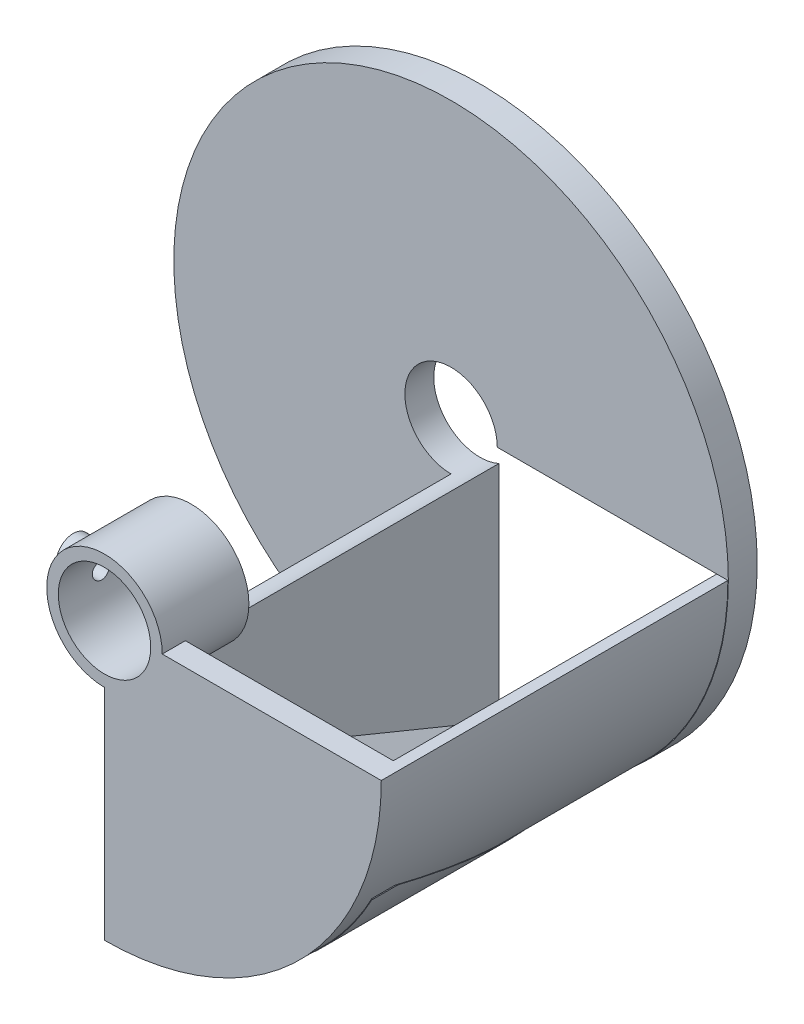
ISO-10303-21;
HEADER;
FILE_DESCRIPTION(('STEP AP214'),'2;1');
FILE_NAME('part.step','',(''),(''),'','','');
FILE_SCHEMA(('AUTOMOTIVE_DESIGN { 1 0 10303 214 1 1 1 1 }'));
ENDSEC;
DATA;
#1=APPLICATION_CONTEXT('core data for automotive mechanical design processes');
#2=APPLICATION_PROTOCOL_DEFINITION('international standard','automotive_design',2000,#1);
#3=PRODUCT_CONTEXT('',#1,'mechanical');
#4=PRODUCT('Part','Part','',(#3));
#5=PRODUCT_RELATED_PRODUCT_CATEGORY('part','',(#4));
#6=PRODUCT_DEFINITION_FORMATION('','',#4);
#7=PRODUCT_DEFINITION_CONTEXT('part definition',#1,'design');
#8=PRODUCT_DEFINITION('design','',#6,#7);
#9=PRODUCT_DEFINITION_SHAPE('','',#8);
#10=(LENGTH_UNIT() NAMED_UNIT(*) SI_UNIT(.MILLI.,.METRE.));
#11=(NAMED_UNIT(*) PLANE_ANGLE_UNIT() SI_UNIT($,.RADIAN.));
#12=(NAMED_UNIT(*) SI_UNIT($,.STERADIAN.) SOLID_ANGLE_UNIT());
#13=UNCERTAINTY_MEASURE_WITH_UNIT(LENGTH_MEASURE(1.E-05),#10,'distance_accuracy_value','');
#14=(GEOMETRIC_REPRESENTATION_CONTEXT(3) GLOBAL_UNCERTAINTY_ASSIGNED_CONTEXT((#13)) GLOBAL_UNIT_ASSIGNED_CONTEXT((#10,
#11,#12)) REPRESENTATION_CONTEXT('',''));
#15=CARTESIAN_POINT('',(0.,0.,0.));
#16=DIRECTION('',(0.,0.,1.));
#17=DIRECTION('',(1.,0.,0.));
#18=AXIS2_PLACEMENT_3D('',#15,#16,#17);
#19=CARTESIAN_POINT('',(42.2763891638967,-45.883169834338,61.));
#20=DIRECTION('',(0.,0.,-1.));
#21=DIRECTION('',(-1.,0.,0.));
#22=AXIS2_PLACEMENT_3D('',#19,#20,#21);
#23=PLANE('',#22);
#24=CARTESIAN_POINT('',(0.,0.,61.));
#25=DIRECTION('',(0.,0.,-1.));
#26=DIRECTION('',(-1.,0.,0.));
#27=AXIS2_PLACEMENT_3D('',#24,#25,#26);
#28=CIRCLE('',#27,48.);
#29=CARTESIAN_POINT('',(42.2763891638967,-22.731188250128,61.));
#30=VERTEX_POINT('',#29);
#31=CARTESIAN_POINT('',(14.0973304548521,-45.883169834338,61.));
#32=VERTEX_POINT('',#31);
#33=EDGE_CURVE('E120',#30,#32,#28,.T.);
#34=ORIENTED_EDGE('',*,*,#33,.F.);
#35=DIRECTION('',(0.,-1.,0.));
#36=VECTOR('',#35,1.);
#37=CARTESIAN_POINT('',(42.2763891638967,-45.883169834338,61.));
#38=LINE('',#37,#36);
#39=CARTESIAN_POINT('',(42.2763891638967,-20.883169834338,61.));
#40=VERTEX_POINT('',#39);
#41=EDGE_CURVE('E111',#40,#30,#38,.T.);
#42=ORIENTED_EDGE('',*,*,#41,.F.);
#43=DIRECTION('',(-1.,0.,0.));
#44=VECTOR('',#43,1.);
#45=CARTESIAN_POINT('',(42.2763891638967,-20.883169834338,61.));
#46=LINE('',#45,#44);
#47=CARTESIAN_POINT('',(3.27638916389669,-20.883169834338,61.));
#48=VERTEX_POINT('',#47);
#49=EDGE_CURVE('E99',#40,#48,#46,.T.);
#50=ORIENTED_EDGE('',*,*,#49,.T.);
#51=DIRECTION('',(0.,-1.,0.));
#52=VECTOR('',#51,1.);
#53=CARTESIAN_POINT('',(3.27638916389669,-45.883169834338,61.));
#54=LINE('',#53,#52);
#55=CARTESIAN_POINT('',(3.27638916389669,-45.883169834338,61.));
#56=VERTEX_POINT('',#55);
#57=EDGE_CURVE('E108',#48,#56,#54,.T.);
#58=ORIENTED_EDGE('',*,*,#57,.T.);
#59=DIRECTION('',(-1.,0.,0.));
#60=VECTOR('',#59,1.);
#61=CARTESIAN_POINT('',(42.2763891638967,-45.883169834338,61.));
#62=LINE('',#61,#60);
#63=EDGE_CURVE('E62',#32,#56,#62,.T.);
#64=ORIENTED_EDGE('',*,*,#63,.F.);
#65=EDGE_LOOP('',(#34,#42,#50,#58,#64));
#66=FACE_BOUND('',#65,.T.);
#67=ADVANCED_FACE('F55',(#66),#23,.F.);
#68=CARTESIAN_POINT('',(42.2763891638967,-45.883169834338,61.));
#69=DIRECTION('',(0.,1.,0.));
#70=DIRECTION('',(0.,0.,1.));
#71=AXIS2_PLACEMENT_3D('',#68,#69,#70);
#72=PLANE('',#71);
#73=DIRECTION('',(0.,0.,-1.));
#74=VECTOR('',#73,1.);
#75=CARTESIAN_POINT('',(14.0973304548521,-45.883169834338,100.));
#76=LINE('',#75,#74);
#77=CARTESIAN_POINT('',(14.0973304548521,-45.883169834338,0.));
#78=VERTEX_POINT('',#77);
#79=EDGE_CURVE('E122',#32,#78,#76,.T.);
#80=ORIENTED_EDGE('',*,*,#79,.F.);
#81=ORIENTED_EDGE('',*,*,#63,.T.);
#82=DIRECTION('',(0.,0.,-1.));
#83=VECTOR('',#82,1.);
#84=CARTESIAN_POINT('',(3.27638916389669,-45.883169834338,61.));
#85=LINE('',#84,#83);
#86=CARTESIAN_POINT('',(3.27638916389669,-45.883169834338,0.));
#87=VERTEX_POINT('',#86);
#88=EDGE_CURVE('E102',#56,#87,#85,.T.);
#89=ORIENTED_EDGE('',*,*,#88,.T.);
#90=DIRECTION('',(-1.,0.,0.));
#91=VECTOR('',#90,1.);
#92=CARTESIAN_POINT('',(42.2763891638967,-45.883169834338,0.));
#93=LINE('',#92,#91);
#94=EDGE_CURVE('E90',#78,#87,#93,.T.);
#95=ORIENTED_EDGE('',*,*,#94,.F.);
#96=EDGE_LOOP('',(#80,#81,#89,#95));
#97=FACE_BOUND('',#96,.T.);
#98=ADVANCED_FACE('F103',(#97),#72,.F.);
#99=CARTESIAN_POINT('',(42.2763891638967,-20.883169834338,61.));
#100=DIRECTION('',(0.,-0.925305138660672,0.379223417483882));
#101=DIRECTION('',(0.,-0.379223417483882,-0.925305138660672));
#102=AXIS2_PLACEMENT_3D('',#99,#100,#101);
#103=PLANE('',#102);
#104=CARTESIAN_POINT('',(0.,0.,111.954934395785));
#105=DIRECTION('',(0.,-0.925305138660672,0.379223417483882));
#106=DIRECTION('',(0.,-0.379223417483882,-0.925305138660672));
#107=AXIS2_PLACEMENT_3D('',#104,#105,#106);
#108=ELLIPSE('',#107,126.574461879164,48.);
#109=CARTESIAN_POINT('',(42.2763891638967,-22.731188250128,56.4908350654723));
#110=VERTEX_POINT('',#109);
#111=EDGE_CURVE('E68',#78,#110,#108,.T.);
#112=ORIENTED_EDGE('',*,*,#111,.F.);
#113=ORIENTED_EDGE('',*,*,#94,.T.);
#114=DIRECTION('',(0.,0.379223417483882,0.925305138660672));
#115=VECTOR('',#114,1.);
#116=CARTESIAN_POINT('',(3.27638916389669,-20.883169834338,61.));
#117=LINE('',#116,#115);
#118=EDGE_CURVE('E94',#87,#48,#117,.T.);
#119=ORIENTED_EDGE('',*,*,#118,.T.);
#120=ORIENTED_EDGE('',*,*,#49,.F.);
#121=DIRECTION('',(0.,0.379223417483882,0.925305138660672));
#122=VECTOR('',#121,1.);
#123=CARTESIAN_POINT('',(42.2763891638967,-20.883169834338,61.));
#124=LINE('',#123,#122);
#125=EDGE_CURVE('E76',#110,#40,#124,.T.);
#126=ORIENTED_EDGE('',*,*,#125,.F.);
#127=EDGE_LOOP('',(#112,#113,#119,#120,#126));
#128=FACE_BOUND('',#127,.T.);
#129=ADVANCED_FACE('F92',(#128),#103,.F.);
#130=CARTESIAN_POINT('',(42.2763891638967,0.,0.));
#131=DIRECTION('',(-1.,0.,0.));
#132=DIRECTION('',(0.,0.,1.));
#133=AXIS2_PLACEMENT_3D('',#130,#131,#132);
#134=PLANE('',#133);
#135=DIRECTION('',(0.,0.,-1.));
#136=VECTOR('',#135,1.);
#137=CARTESIAN_POINT('',(42.2763891638967,-22.731188250128,100.));
#138=LINE('',#137,#136);
#139=EDGE_CURVE('E12',#110,#30,#138,.F.);
#140=ORIENTED_EDGE('',*,*,#139,.F.);
#141=ORIENTED_EDGE('',*,*,#125,.T.);
#142=ORIENTED_EDGE('',*,*,#41,.T.);
#143=EDGE_LOOP('',(#140,#141,#142));
#144=FACE_BOUND('',#143,.T.);
#145=ADVANCED_FACE('F129',(#144),#134,.F.);
#146=CARTESIAN_POINT('',(3.27638916389669,0.,0.));
#147=DIRECTION('',(-1.,0.,0.));
#148=DIRECTION('',(0.,0.,1.));
#149=AXIS2_PLACEMENT_3D('',#146,#147,#148);
#150=PLANE('',#149);
#151=ORIENTED_EDGE('',*,*,#57,.F.);
#152=ORIENTED_EDGE('',*,*,#118,.F.);
#153=ORIENTED_EDGE('',*,*,#88,.F.);
#154=EDGE_LOOP('',(#151,#152,#153));
#155=FACE_BOUND('',#154,.T.);
#156=ADVANCED_FACE('F110',(#155),#150,.T.);
#157=CARTESIAN_POINT('',(0.,0.,100.));
#158=DIRECTION('',(0.,0.,-1.));
#159=DIRECTION('',(-1.,0.,0.));
#160=AXIS2_PLACEMENT_3D('',#157,#158,#159);
#161=CYLINDRICAL_SURFACE('',#160,48.);
#162=ORIENTED_EDGE('',*,*,#33,.T.);
#163=ORIENTED_EDGE('',*,*,#79,.T.);
#164=ORIENTED_EDGE('',*,*,#111,.T.);
#165=ORIENTED_EDGE('',*,*,#139,.T.);
#166=EDGE_LOOP('',(#162,#163,#164,#165));
#167=FACE_BOUND('',#166,.T.);
#168=ADVANCED_FACE('F126',(#167),#161,.T.);
#169=CLOSED_SHELL('',(#67,#98,#129,#145,#156,#168));
#170=MANIFOLD_SOLID_BREP('B2',#169);
#171=CARTESIAN_POINT('',(0.,0.,0.));
#172=DIRECTION('',(0.,0.,1.));
#173=DIRECTION('',(1.,0.,0.));
#174=AXIS2_PLACEMENT_3D('',#171,#172,#173);
#175=PLANE('',#174);
#176=CARTESIAN_POINT('',(0.,0.,0.));
#177=DIRECTION('',(0.,0.,1.));
#178=DIRECTION('',(1.,0.,0.));
#179=AXIS2_PLACEMENT_3D('',#176,#177,#178);
#180=CIRCLE('',#179,48.);
#181=CARTESIAN_POINT('',(48.,0.,0.));
#182=VERTEX_POINT('',#181);
#183=EDGE_CURVE('E357',#182,#182,#180,.T.);
#184=ORIENTED_EDGE('',*,*,#183,.F.);
#185=EDGE_LOOP('',(#184));
#186=FACE_BOUND('',#185,.T.);
#187=DIRECTION('',(-1.,0.,0.));
#188=VECTOR('',#187,1.);
#189=CARTESIAN_POINT('',(0.,0.,0.));
#190=LINE('',#189,#188);
#191=CARTESIAN_POINT('',(46.,0.,0.));
#192=VERTEX_POINT('',#191);
#193=CARTESIAN_POINT('',(8.,0.,0.));
#194=VERTEX_POINT('',#193);
#195=EDGE_CURVE('E433',#192,#194,#190,.T.);
#196=ORIENTED_EDGE('',*,*,#195,.T.);
#197=CARTESIAN_POINT('',(0.,0.,0.));
#198=DIRECTION('',(0.,0.,1.));
#199=DIRECTION('',(1.,0.,0.));
#200=AXIS2_PLACEMENT_3D('',#197,#198,#199);
#201=CIRCLE('',#200,8.);
#202=CARTESIAN_POINT('',(3.27638916389669,-7.29830624506127,0.));
#203=VERTEX_POINT('',#202);
#204=EDGE_CURVE('E365',#194,#203,#201,.T.);
#205=ORIENTED_EDGE('',*,*,#204,.T.);
#206=DIRECTION('',(0.,-1.,0.));
#207=VECTOR('',#206,1.);
#208=CARTESIAN_POINT('',(3.27638916389669,0.,0.));
#209=LINE('',#208,#207);
#210=CARTESIAN_POINT('',(3.27638916389669,-45.883169834338,0.));
#211=VERTEX_POINT('',#210);
#212=EDGE_CURVE('E424',#203,#211,#209,.T.);
#213=ORIENTED_EDGE('',*,*,#212,.T.);
#214=CARTESIAN_POINT('',(0.,0.,0.));
#215=DIRECTION('',(0.,0.,-1.));
#216=DIRECTION('',(-1.,0.,0.));
#217=AXIS2_PLACEMENT_3D('',#214,#215,#216);
#218=CIRCLE('',#217,46.);
#219=EDGE_CURVE('E429',#192,#211,#218,.T.);
#220=ORIENTED_EDGE('',*,*,#219,.F.);
#221=EDGE_LOOP('',(#196,#205,#213,#220));
#222=FACE_BOUND('',#221,.T.);
#223=ADVANCED_FACE('F191',(#186,#222),#175,.F.);
#224=CARTESIAN_POINT('',(0.,0.,5.));
#225=DIRECTION('',(0.,0.,-1.));
#226=DIRECTION('',(-1.,0.,0.));
#227=AXIS2_PLACEMENT_3D('',#224,#225,#226);
#228=CYLINDRICAL_SURFACE('',#227,8.);
#229=CARTESIAN_POINT('',(-8.,0.,59.1162877048764));
#230=CARTESIAN_POINT('',(-7.99999848833852,-0.0834717464654708,59.1162845152881));
#231=CARTESIAN_POINT('',(-7.99868009921714,-0.166984992730098,59.109296628257));
#232=CARTESIAN_POINT('',(-7.9935478589052,-0.331658129841798,59.081547709758));
#233=CARTESIAN_POINT('',(-7.98973190166897,-0.412815974152227,59.0607750542366));
#234=CARTESIAN_POINT('',(-7.98003138765458,-0.570372961851803,59.006115003617));
#235=CARTESIAN_POINT('',(-7.97414869946483,-0.646776330685345,58.9722394524238));
#236=CARTESIAN_POINT('',(-7.96095710599783,-0.792807973094008,58.8923688279536));
#237=CARTESIAN_POINT('',(-7.9536483161829,-0.862436794477325,58.8463747357316));
#238=CARTESIAN_POINT('',(-7.93831336430504,-0.993783715930505,58.7429879368727));
#239=CARTESIAN_POINT('',(-7.93028034856351,-1.05540895503183,58.6854782602062));
#240=CARTESIAN_POINT('',(-7.9144531845865,-1.16819606135369,58.5609443957888));
#241=CARTESIAN_POINT('',(-7.90665905354527,-1.21935717689242,58.4939195251071));
#242=CARTESIAN_POINT('',(-7.89212551245005,-1.31014998665793,58.3516016165124));
#243=CARTESIAN_POINT('',(-7.88539493886182,-1.34968721969605,58.2762473345591));
#244=CARTESIAN_POINT('',(-7.87384713211987,-1.41550524332283,58.1198187896996));
#245=CARTESIAN_POINT('',(-7.86902973396962,-1.44178717713098,58.0387450207652));
#246=CARTESIAN_POINT('',(-7.8619226957455,-1.480050535035,57.874172473962));
#247=CARTESIAN_POINT('',(-7.85960445366405,-1.49219390192039,57.7907126076729));
#248=CARTESIAN_POINT('',(-7.85767197152761,-1.50233808095347,57.6229103200681));
#249=CARTESIAN_POINT('',(-7.8580574889876,-1.50034016135374,57.5385679785741));
#250=CARTESIAN_POINT('',(-7.86146292701753,-1.48238979602363,57.3725681796103));
#251=CARTESIAN_POINT('',(-7.86444808147334,-1.46662149996045,57.2908899905762));
#252=CARTESIAN_POINT('',(-7.87266183284666,-1.42186799396207,57.1313592850938));
#253=CARTESIAN_POINT('',(-7.87789052509516,-1.392882222395,57.0535069313671));
#254=CARTESIAN_POINT('',(-7.89003855292588,-1.322336471793,56.9032990258761));
#255=CARTESIAN_POINT('',(-7.89696783823366,-1.28070213532456,56.8309792342956));
#256=CARTESIAN_POINT('',(-7.91172971602918,-1.18609368930417,56.6942829763361));
#257=CARTESIAN_POINT('',(-7.91956240015522,-1.13311842889266,56.6299073171616));
#258=CARTESIAN_POINT('',(-7.93540001272164,-1.01633905685298,56.5098627492039));
#259=CARTESIAN_POINT('',(-7.94340571024031,-0.952377436860684,56.4543470524246));
#260=CARTESIAN_POINT('',(-7.95857386108318,-0.815968037098826,56.354810464201));
#261=CARTESIAN_POINT('',(-7.96573630595245,-0.743520172255768,56.3107896880059));
#262=CARTESIAN_POINT('',(-7.97842539677509,-0.592034988874666,56.2354699510063));
#263=CARTESIAN_POINT('',(-7.98394999136289,-0.512989564446492,56.2041869257585));
#264=CARTESIAN_POINT('',(-7.99272505402719,-0.350639115398696,56.1553856117842));
#265=CARTESIAN_POINT('',(-7.99597576367994,-0.267334544277788,56.137865860831));
#266=CARTESIAN_POINT('',(-7.99980360641981,-0.100148652903388,56.1173016738581));
#267=CARTESIAN_POINT('',(-8.00041950912279,-0.0162940126341374,56.1140473133466));
#268=CARTESIAN_POINT('',(-7.99901543598228,0.150761248092183,56.121543184424));
#269=CARTESIAN_POINT('',(-7.99699558964431,0.233961900480384,56.1322927279416));
#270=CARTESIAN_POINT('',(-7.99057111500406,0.396681573218216,56.1673167400597));
#271=CARTESIAN_POINT('',(-7.98618522374031,0.476224261046063,56.1914849874142));
#272=CARTESIAN_POINT('',(-7.97551842212498,0.630128631824633,56.2525454116551));
#273=CARTESIAN_POINT('',(-7.96923738311334,0.704489962595104,56.2894384524421));
#274=CARTESIAN_POINT('',(-7.95538030357666,0.846816671513216,56.3753658330359));
#275=CARTESIAN_POINT('',(-7.94779086174563,0.914703277015123,56.4245284434132));
#276=CARTESIAN_POINT('',(-7.93219343489711,1.04133832326455,56.5334258422387));
#277=CARTESIAN_POINT('',(-7.92418541084687,1.10008590976087,56.5931616178777));
#278=CARTESIAN_POINT('',(-7.9085247569745,1.20757295872048,56.7224600237878));
#279=CARTESIAN_POINT('',(-7.90087825860257,1.25616916218577,56.7921426130018));
#280=CARTESIAN_POINT('',(-7.88692985578532,1.34096675057787,56.9388053294001));
#281=CARTESIAN_POINT('',(-7.8806279013735,1.37716859613924,57.0157851852468));
#282=CARTESIAN_POINT('',(-7.87013024209574,1.43594673512823,57.1744935721189));
#283=CARTESIAN_POINT('',(-7.86592440436878,1.45858868794786,57.2561970844357));
#284=CARTESIAN_POINT('',(-7.86007203802415,1.48980679326236,57.4223349273978));
#285=CARTESIAN_POINT('',(-7.8584252206579,1.49838453270709,57.5067689488468));
#286=CARTESIAN_POINT('',(-7.85789199803857,1.50117762148355,57.6745360363179));
#287=CARTESIAN_POINT('',(-7.85896215974293,1.49561895003499,57.7578652858334));
#288=CARTESIAN_POINT('',(-7.86364600659998,1.47079175378803,57.9223791269217));
#289=CARTESIAN_POINT('',(-7.86725967655746,1.45152331089332,58.0035637313038));
#290=CARTESIAN_POINT('',(-7.8766050802318,1.39991887583263,58.1613621896718));
#291=CARTESIAN_POINT('',(-7.88233284594965,1.36760735397253,58.2379842962221));
#292=CARTESIAN_POINT('',(-7.8952638755184,1.29085868912205,58.3847559591172));
#293=CARTESIAN_POINT('',(-7.90246724360119,1.24642068948186,58.4549050577211));
#294=CARTESIAN_POINT('',(-7.91767266107745,1.14589487339535,58.5878713849187));
#295=CARTESIAN_POINT('',(-7.92568505353043,1.08964259864304,58.6505631174435));
#296=CARTESIAN_POINT('',(-7.94152833918735,0.967427926742292,58.7656928673409));
#297=CARTESIAN_POINT('',(-7.94935919027328,0.901463301891619,58.8181285258565));
#298=CARTESIAN_POINT('',(-7.96403975968049,0.760984945071878,58.9116986575034));
#299=CARTESIAN_POINT('',(-7.97088000990561,0.68639959064052,58.952727133367));
#300=CARTESIAN_POINT('',(-7.98271619380687,0.531290113653835,59.0216053414815));
#301=CARTESIAN_POINT('',(-7.98771385879037,0.450771651705248,59.0494674519233));
#302=CARTESIAN_POINT('',(-7.99428290707632,0.308347202825153,59.085565019295));
#303=CARTESIAN_POINT('',(-7.99641470878206,0.247273810251871,59.0970663351892));
#304=CARTESIAN_POINT('',(-7.9992737995401,0.124141247115158,59.1124287669928));
#305=CARTESIAN_POINT('',(-8.00000112429805,0.0620821016527095,59.1162900771323));
#306=CARTESIAN_POINT('',(-8.,0.,59.1162877048764));
#307=B_SPLINE_CURVE_WITH_KNOTS('',3,(#229,#230,#231,#232,#233,#234,#235,#236,#237,#238,#239,
#240,#241,#242,#243,#244,#245,#246,#247,#248,#249,#250,#251,#252,#253,#254,#255,#256,#257,#258,
#259,#260,#261,#262,#263,#264,#265,#266,#267,#268,#269,#270,#271,#272,#273,#274,#275,#276,#277,
#278,#279,#280,#281,#282,#283,#284,#285,#286,#287,#288,#289,#290,#291,#292,#293,#294,#295,#296,
#297,#298,#299,#300,#301,#302,#303,#304,#305,#306),.UNSPECIFIED.,.T.,.F.,(4,2,2,2,2,2,2,2,2,2,2,
2,2,2,2,2,2,2,2,2,2,2,2,2,2,2,2,2,2,2,2,2,2,2,2,2,2,2,4),(0.,0.250188200964924,
0.500587642535451,0.750761271230911,1.00091465336891,1.25375118013631,1.50660586283617,
1.76146190504357,2.01629596311948,2.26818151445336,2.52004447587256,2.76859000612767,
3.01714609846788,3.26719262629531,3.5172645404986,3.77127768464078,4.02529337544949,
4.279625883217,4.53393136673746,4.78448174076098,5.03501980464585,5.2836023390783,
5.53220175338033,5.7835177801771,6.034857284131,6.28953436987301,6.54420198954946,
6.79762627818559,7.05102196946514,7.3003925223175,7.54976158541508,7.79866496207694,
8.04758592655425,8.30023369966383,8.55293951262257,8.80792048916317,9.06266126931176,
9.24874344524412,9.43482089039543),.UNSPECIFIED.);
#308=CARTESIAN_POINT('',(-8.,0.,59.1162877048764));
#309=VERTEX_POINT('',#308);
#310=EDGE_CURVE('E313',#309,#309,#307,.T.);
#311=ORIENTED_EDGE('',*,*,#310,.F.);
#312=EDGE_LOOP('',(#311));
#313=FACE_BOUND('',#312,.T.);
#314=CARTESIAN_POINT('',(0.,0.,50.));
#315=DIRECTION('',(0.,0.,1.));
#316=DIRECTION('',(1.,0.,0.));
#317=AXIS2_PLACEMENT_3D('',#314,#315,#316);
#318=CIRCLE('',#317,8.);
#319=CARTESIAN_POINT('',(3.27638916389669,-7.29830624506127,50.));
#320=VERTEX_POINT('',#319);
#321=CARTESIAN_POINT('',(0.,-8.,50.));
#322=VERTEX_POINT('',#321);
#323=EDGE_CURVE('E322',#320,#322,#318,.T.);
#324=ORIENTED_EDGE('',*,*,#323,.F.);
#325=DIRECTION('',(0.,0.,-1.));
#326=VECTOR('',#325,1.);
#327=CARTESIAN_POINT('',(3.27638916389669,-7.29830624506127,61.));
#328=LINE('',#327,#326);
#329=EDGE_CURVE('E419',#320,#203,#328,.T.);
#330=ORIENTED_EDGE('',*,*,#329,.T.);
#331=ORIENTED_EDGE('',*,*,#204,.F.);
#332=DIRECTION('',(0.,0.,-1.));
#333=VECTOR('',#332,1.);
#334=CARTESIAN_POINT('',(8.,0.,61.));
#335=LINE('',#334,#333);
#336=CARTESIAN_POINT('',(8.,0.,5.));
#337=VERTEX_POINT('',#336);
#338=EDGE_CURVE('E398',#337,#194,#335,.T.);
#339=ORIENTED_EDGE('',*,*,#338,.F.);
#340=CARTESIAN_POINT('',(0.,0.,5.));
#341=DIRECTION('',(0.,0.,1.));
#342=DIRECTION('',(1.,0.,0.));
#343=AXIS2_PLACEMENT_3D('',#340,#341,#342);
#344=CIRCLE('',#343,8.);
#345=CARTESIAN_POINT('',(0.,-8.,5.));
#346=VERTEX_POINT('',#345);
#347=EDGE_CURVE('E361',#337,#346,#344,.T.);
#348=ORIENTED_EDGE('',*,*,#347,.T.);
#349=DIRECTION('',(0.,0.,-1.));
#350=VECTOR('',#349,1.);
#351=CARTESIAN_POINT('',(0.,-8.,65.));
#352=LINE('',#351,#350);
#353=EDGE_CURVE('E369',#322,#346,#352,.T.);
#354=ORIENTED_EDGE('',*,*,#353,.F.);
#355=EDGE_LOOP('',(#324,#330,#331,#339,#348,#354));
#356=FACE_BOUND('',#355,.T.);
#357=CARTESIAN_POINT('',(0.,0.,65.));
#358=DIRECTION('',(0.,0.,-1.));
#359=DIRECTION('',(1.,0.,0.));
#360=AXIS2_PLACEMENT_3D('',#357,#358,#359);
#361=CIRCLE('',#360,8.);
#362=CARTESIAN_POINT('',(8.,0.,65.));
#363=VERTEX_POINT('',#362);
#364=EDGE_CURVE('E388',#363,#363,#361,.T.);
#365=ORIENTED_EDGE('',*,*,#364,.F.);
#366=EDGE_LOOP('',(#365));
#367=FACE_BOUND('',#366,.T.);
#368=ADVANCED_FACE('F324',(#313,#356,#367),#228,.F.);
#369=CARTESIAN_POINT('',(0.,0.,5.));
#370=DIRECTION('',(0.,0.,1.));
#371=DIRECTION('',(1.,0.,0.));
#372=AXIS2_PLACEMENT_3D('',#369,#370,#371);
#373=PLANE('',#372);
#374=DIRECTION('',(-1.,0.,0.));
#375=VECTOR('',#374,1.);
#376=CARTESIAN_POINT('',(47.9183070965353,0.,5.));
#377=LINE('',#376,#375);
#378=CARTESIAN_POINT('',(47.9183070965353,0.,5.));
#379=VERTEX_POINT('',#378);
#380=CARTESIAN_POINT('',(46.,0.,5.));
#381=VERTEX_POINT('',#380);
#382=EDGE_CURVE('E384',#379,#381,#377,.T.);
#383=ORIENTED_EDGE('',*,*,#382,.F.);
#384=CARTESIAN_POINT('',(0.,0.,5.));
#385=DIRECTION('',(0.,0.,1.));
#386=DIRECTION('',(1.,0.,0.));
#387=AXIS2_PLACEMENT_3D('',#384,#385,#386);
#388=CIRCLE('',#387,47.9183070965353);
#389=CARTESIAN_POINT('',(0.,-47.9183070965353,5.));
#390=VERTEX_POINT('',#389);
#391=EDGE_CURVE('E390',#390,#379,#388,.T.);
#392=ORIENTED_EDGE('',*,*,#391,.F.);
#393=DIRECTION('',(0.,-1.,0.));
#394=VECTOR('',#393,1.);
#395=CARTESIAN_POINT('',(0.,-8.,5.));
#396=LINE('',#395,#394);
#397=EDGE_CURVE('E394',#346,#390,#396,.T.);
#398=ORIENTED_EDGE('',*,*,#397,.F.);
#399=ORIENTED_EDGE('',*,*,#347,.F.);
#400=EDGE_CURVE('E389',#381,#337,#377,.T.);
#401=ORIENTED_EDGE('',*,*,#400,.F.);
#402=EDGE_LOOP('',(#383,#392,#398,#399,#401));
#403=FACE_BOUND('',#402,.T.);
#404=CARTESIAN_POINT('',(0.,0.,5.));
#405=DIRECTION('',(0.,0.,1.));
#406=DIRECTION('',(1.,0.,0.));
#407=AXIS2_PLACEMENT_3D('',#404,#405,#406);
#408=CIRCLE('',#407,48.);
#409=CARTESIAN_POINT('',(48.,0.,5.));
#410=VERTEX_POINT('',#409);
#411=EDGE_CURVE('E356',#410,#410,#408,.T.);
#412=ORIENTED_EDGE('',*,*,#411,.T.);
#413=EDGE_LOOP('',(#412));
#414=FACE_BOUND('',#413,.T.);
#415=ADVANCED_FACE('F522',(#403,#414),#373,.T.);
#416=CARTESIAN_POINT('',(0.,0.,5.));
#417=DIRECTION('',(0.,0.,-1.));
#418=DIRECTION('',(-1.,0.,0.));
#419=AXIS2_PLACEMENT_3D('',#416,#417,#418);
#420=CYLINDRICAL_SURFACE('',#419,48.);
#421=ORIENTED_EDGE('',*,*,#411,.F.);
#422=EDGE_LOOP('',(#421));
#423=FACE_BOUND('',#422,.T.);
#424=ORIENTED_EDGE('',*,*,#183,.T.);
#425=EDGE_LOOP('',(#424));
#426=FACE_BOUND('',#425,.T.);
#427=ADVANCED_FACE('F193',(#423,#426),#420,.T.);
#428=CARTESIAN_POINT('',(0.,-8.,65.));
#429=DIRECTION('',(1.,0.,0.));
#430=DIRECTION('',(0.,1.,0.));
#431=AXIS2_PLACEMENT_3D('',#428,#429,#430);
#432=PLANE('',#431);
#433=DIRECTION('',(0.,-1.,0.));
#434=VECTOR('',#433,1.);
#435=CARTESIAN_POINT('',(0.,-8.,65.));
#436=LINE('',#435,#434);
#437=CARTESIAN_POINT('',(0.,-10.,65.));
#438=VERTEX_POINT('',#437);
#439=CARTESIAN_POINT('',(0.,-47.9183070965353,65.));
#440=VERTEX_POINT('',#439);
#441=EDGE_CURVE('E405',#438,#440,#436,.T.);
#442=ORIENTED_EDGE('',*,*,#441,.F.);
#443=DIRECTION('',(0.,0.,1.));
#444=VECTOR('',#443,1.);
#445=CARTESIAN_POINT('',(0.,-10.,50.));
#446=LINE('',#445,#444);
#447=CARTESIAN_POINT('',(0.,-10.,50.));
#448=VERTEX_POINT('',#447);
#449=EDGE_CURVE('E451',#438,#448,#446,.F.);
#450=ORIENTED_EDGE('',*,*,#449,.T.);
#451=DIRECTION('',(0.,-1.,0.));
#452=VECTOR('',#451,1.);
#453=CARTESIAN_POINT('',(0.,-8.,50.));
#454=LINE('',#453,#452);
#455=EDGE_CURVE('E437',#322,#448,#454,.T.);
#456=ORIENTED_EDGE('',*,*,#455,.F.);
#457=ORIENTED_EDGE('',*,*,#353,.T.);
#458=ORIENTED_EDGE('',*,*,#397,.T.);
#459=DIRECTION('',(0.,0.,-1.));
#460=VECTOR('',#459,1.);
#461=CARTESIAN_POINT('',(0.,-47.9183070965353,65.));
#462=LINE('',#461,#460);
#463=EDGE_CURVE('E375',#440,#390,#462,.T.);
#464=ORIENTED_EDGE('',*,*,#463,.F.);
#465=EDGE_LOOP('',(#442,#450,#456,#457,#458,#464));
#466=FACE_BOUND('',#465,.T.);
#467=ADVANCED_FACE('F475',(#466),#432,.F.);
#468=CARTESIAN_POINT('',(0.,0.,65.));
#469=DIRECTION('',(0.,0.,-1.));
#470=DIRECTION('',(-1.,0.,0.));
#471=AXIS2_PLACEMENT_3D('',#468,#469,#470);
#472=CYLINDRICAL_SURFACE('',#471,47.9183070965353);
#473=ORIENTED_EDGE('',*,*,#391,.T.);
#474=DIRECTION('',(0.,0.,-1.));
#475=VECTOR('',#474,1.);
#476=CARTESIAN_POINT('',(47.9183070965353,0.,65.));
#477=LINE('',#476,#475);
#478=CARTESIAN_POINT('',(47.9183070965353,0.,65.));
#479=VERTEX_POINT('',#478);
#480=EDGE_CURVE('E379',#479,#379,#477,.T.);
#481=ORIENTED_EDGE('',*,*,#480,.F.);
#482=CARTESIAN_POINT('',(0.,0.,65.));
#483=DIRECTION('',(0.,0.,1.));
#484=DIRECTION('',(1.,0.,0.));
#485=AXIS2_PLACEMENT_3D('',#482,#483,#484);
#486=CIRCLE('',#485,47.9183070965353);
#487=EDGE_CURVE('E402',#440,#479,#486,.T.);
#488=ORIENTED_EDGE('',*,*,#487,.F.);
#489=ORIENTED_EDGE('',*,*,#463,.T.);
#490=EDGE_LOOP('',(#473,#481,#488,#489));
#491=FACE_BOUND('',#490,.T.);
#492=ADVANCED_FACE('F537',(#491),#472,.T.);
#493=CARTESIAN_POINT('',(47.9183070965353,0.,65.));
#494=DIRECTION('',(0.,-1.,0.));
#495=DIRECTION('',(1.,0.,0.));
#496=AXIS2_PLACEMENT_3D('',#493,#494,#495);
#497=PLANE('',#496);
#498=DIRECTION('',(-1.,0.,0.));
#499=VECTOR('',#498,1.);
#500=CARTESIAN_POINT('',(0.,0.,61.));
#501=LINE('',#500,#499);
#502=CARTESIAN_POINT('',(46.,0.,61.));
#503=VERTEX_POINT('',#502);
#504=CARTESIAN_POINT('',(10.,0.,61.));
#505=VERTEX_POINT('',#504);
#506=EDGE_CURVE('E428',#503,#505,#501,.T.);
#507=ORIENTED_EDGE('',*,*,#506,.T.);
#508=DIRECTION('',(0.,0.,1.));
#509=VECTOR('',#508,1.);
#510=CARTESIAN_POINT('',(10.,0.,50.));
#511=LINE('',#510,#509);
#512=CARTESIAN_POINT('',(10.,0.,65.));
#513=VERTEX_POINT('',#512);
#514=EDGE_CURVE('E454',#505,#513,#511,.T.);
#515=ORIENTED_EDGE('',*,*,#514,.T.);
#516=DIRECTION('',(-1.,0.,0.));
#517=VECTOR('',#516,1.);
#518=CARTESIAN_POINT('',(47.9183070965353,0.,65.));
#519=LINE('',#518,#517);
#520=EDGE_CURVE('E383',#479,#513,#519,.T.);
#521=ORIENTED_EDGE('',*,*,#520,.F.);
#522=ORIENTED_EDGE('',*,*,#480,.T.);
#523=ORIENTED_EDGE('',*,*,#382,.T.);
#524=DIRECTION('',(0.,0.,-1.));
#525=VECTOR('',#524,1.);
#526=CARTESIAN_POINT('',(46.,0.,61.));
#527=LINE('',#526,#525);
#528=EDGE_CURVE('E411',#503,#381,#527,.T.);
#529=ORIENTED_EDGE('',*,*,#528,.F.);
#530=EDGE_LOOP('',(#507,#515,#521,#522,#523,#529));
#531=FACE_BOUND('',#530,.T.);
#532=ADVANCED_FACE('F486',(#531),#497,.F.);
#533=CARTESIAN_POINT('',(0.,0.,65.));
#534=DIRECTION('',(0.,0.,1.));
#535=DIRECTION('',(1.,0.,0.));
#536=AXIS2_PLACEMENT_3D('',#533,#534,#535);
#537=PLANE('',#536);
#538=CARTESIAN_POINT('',(0.,0.,65.));
#539=DIRECTION('',(0.,0.,1.));
#540=DIRECTION('',(1.,0.,0.));
#541=AXIS2_PLACEMENT_3D('',#538,#539,#540);
#542=CIRCLE('',#541,10.);
#543=EDGE_CURVE('E462',#513,#438,#542,.T.);
#544=ORIENTED_EDGE('',*,*,#543,.T.);
#545=ORIENTED_EDGE('',*,*,#441,.T.);
#546=ORIENTED_EDGE('',*,*,#487,.T.);
#547=ORIENTED_EDGE('',*,*,#520,.T.);
#548=EDGE_LOOP('',(#544,#545,#546,#547));
#549=FACE_BOUND('',#548,.T.);
#550=ORIENTED_EDGE('',*,*,#364,.T.);
#551=EDGE_LOOP('',(#550));
#552=FACE_BOUND('',#551,.T.);
#553=ADVANCED_FACE('F480',(#549,#552),#537,.T.);
#554=CARTESIAN_POINT('',(0.,0.,61.));
#555=DIRECTION('',(0.,-1.,0.));
#556=DIRECTION('',(0.,0.,-1.));
#557=AXIS2_PLACEMENT_3D('',#554,#555,#556);
#558=PLANE('',#557);
#559=ORIENTED_EDGE('',*,*,#338,.T.);
#560=ORIENTED_EDGE('',*,*,#195,.F.);
#561=EDGE_CURVE('E416',#381,#192,#527,.T.);
#562=ORIENTED_EDGE('',*,*,#561,.F.);
#563=ORIENTED_EDGE('',*,*,#400,.T.);
#564=EDGE_LOOP('',(#559,#560,#562,#563));
#565=FACE_BOUND('',#564,.T.);
#566=ADVANCED_FACE('F548',(#565),#558,.T.);
#567=CARTESIAN_POINT('',(3.27638916389669,0.,61.));
#568=DIRECTION('',(1.,0.,0.));
#569=DIRECTION('',(0.,0.,-1.));
#570=AXIS2_PLACEMENT_3D('',#567,#568,#569);
#571=PLANE('',#570);
#572=DIRECTION('',(0.,0.,1.));
#573=VECTOR('',#572,1.);
#574=CARTESIAN_POINT('',(3.27638916389669,-9.44803016753759,50.));
#575=LINE('',#574,#573);
#576=CARTESIAN_POINT('',(3.27638916389669,-9.44803016753759,61.));
#577=VERTEX_POINT('',#576);
#578=CARTESIAN_POINT('',(3.27638916389669,-9.44803016753759,50.));
#579=VERTEX_POINT('',#578);
#580=EDGE_CURVE('E457',#577,#579,#575,.F.);
#581=ORIENTED_EDGE('',*,*,#580,.F.);
#582=DIRECTION('',(0.,-1.,0.));
#583=VECTOR('',#582,1.);
#584=CARTESIAN_POINT('',(3.27638916389669,0.,61.));
#585=LINE('',#584,#583);
#586=CARTESIAN_POINT('',(3.27638916389669,-45.883169834338,61.));
#587=VERTEX_POINT('',#586);
#588=EDGE_CURVE('E438',#577,#587,#585,.T.);
#589=ORIENTED_EDGE('',*,*,#588,.T.);
#590=DIRECTION('',(0.,0.,-1.));
#591=VECTOR('',#590,1.);
#592=CARTESIAN_POINT('',(3.27638916389669,-45.883169834338,61.));
#593=LINE('',#592,#591);
#594=EDGE_CURVE('E415',#587,#211,#593,.T.);
#595=ORIENTED_EDGE('',*,*,#594,.T.);
#596=ORIENTED_EDGE('',*,*,#212,.F.);
#597=ORIENTED_EDGE('',*,*,#329,.F.);
#598=DIRECTION('',(0.,-1.,0.));
#599=VECTOR('',#598,1.);
#600=CARTESIAN_POINT('',(3.27638916389669,0.,50.));
#601=LINE('',#600,#599);
#602=EDGE_CURVE('E292',#320,#579,#601,.T.);
#603=ORIENTED_EDGE('',*,*,#602,.T.);
#604=EDGE_LOOP('',(#581,#589,#595,#596,#597,#603));
#605=FACE_BOUND('',#604,.T.);
#606=ADVANCED_FACE('F498',(#605),#571,.T.);
#607=CARTESIAN_POINT('',(0.,0.,61.));
#608=DIRECTION('',(0.,0.,-1.));
#609=DIRECTION('',(-1.,0.,0.));
#610=AXIS2_PLACEMENT_3D('',#607,#608,#609);
#611=CYLINDRICAL_SURFACE('',#610,46.);
#612=ORIENTED_EDGE('',*,*,#219,.T.);
#613=ORIENTED_EDGE('',*,*,#594,.F.);
#614=CARTESIAN_POINT('',(0.,0.,61.));
#615=DIRECTION('',(0.,0.,-1.));
#616=DIRECTION('',(-1.,0.,0.));
#617=AXIS2_PLACEMENT_3D('',#614,#615,#616);
#618=CIRCLE('',#617,46.);
#619=EDGE_CURVE('E441',#503,#587,#618,.T.);
#620=ORIENTED_EDGE('',*,*,#619,.F.);
#621=ORIENTED_EDGE('',*,*,#528,.T.);
#622=ORIENTED_EDGE('',*,*,#561,.T.);
#623=EDGE_LOOP('',(#612,#613,#620,#621,#622));
#624=FACE_BOUND('',#623,.T.);
#625=ADVANCED_FACE('F493',(#624),#611,.F.);
#626=CARTESIAN_POINT('',(0.,0.,61.));
#627=DIRECTION('',(0.,0.,-1.));
#628=DIRECTION('',(-1.,0.,0.));
#629=AXIS2_PLACEMENT_3D('',#626,#627,#628);
#630=PLANE('',#629);
#631=CARTESIAN_POINT('',(0.,0.,61.));
#632=DIRECTION('',(0.,0.,-1.));
#633=DIRECTION('',(-1.,0.,0.));
#634=AXIS2_PLACEMENT_3D('',#631,#632,#633);
#635=CIRCLE('',#634,10.);
#636=EDGE_CURVE('E352',#505,#577,#635,.T.);
#637=ORIENTED_EDGE('',*,*,#636,.F.);
#638=ORIENTED_EDGE('',*,*,#506,.F.);
#639=ORIENTED_EDGE('',*,*,#619,.T.);
#640=ORIENTED_EDGE('',*,*,#588,.F.);
#641=EDGE_LOOP('',(#637,#638,#639,#640));
#642=FACE_BOUND('',#641,.T.);
#643=ADVANCED_FACE('F338',(#642),#630,.T.);
#644=CARTESIAN_POINT('',(0.,0.,50.));
#645=DIRECTION('',(0.,0.,1.));
#646=DIRECTION('',(1.,0.,0.));
#647=AXIS2_PLACEMENT_3D('',#644,#645,#646);
#648=PLANE('',#647);
#649=ORIENTED_EDGE('',*,*,#323,.T.);
#650=ORIENTED_EDGE('',*,*,#455,.T.);
#651=CARTESIAN_POINT('',(0.,0.,50.));
#652=DIRECTION('',(0.,0.,1.));
#653=DIRECTION('',(1.,0.,0.));
#654=AXIS2_PLACEMENT_3D('',#651,#652,#653);
#655=CIRCLE('',#654,10.);
#656=EDGE_CURVE('E461',#579,#448,#655,.T.);
#657=ORIENTED_EDGE('',*,*,#656,.F.);
#658=ORIENTED_EDGE('',*,*,#602,.F.);
#659=EDGE_LOOP('',(#649,#650,#657,#658));
#660=FACE_BOUND('',#659,.T.);
#661=ADVANCED_FACE('F336',(#660),#648,.F.);
#662=CARTESIAN_POINT('',(0.,0.,50.));
#663=DIRECTION('',(0.,0.,1.));
#664=DIRECTION('',(1.,0.,0.));
#665=AXIS2_PLACEMENT_3D('',#662,#663,#664);
#666=CYLINDRICAL_SURFACE('',#665,10.);
#667=DIRECTION('',(0.,0.,1.));
#668=VECTOR('',#667,1.);
#669=CARTESIAN_POINT('',(-9.79095796466864,2.03399659146514,50.));
#670=LINE('',#669,#668);
#671=CARTESIAN_POINT('',(-9.79095796466864,2.03399659146514,59.8214765552718));
#672=VERTEX_POINT('',#671);
#673=CARTESIAN_POINT('',(-9.79095796466864,2.03399659146514,55.411098854481));
#674=VERTEX_POINT('',#673);
#675=EDGE_CURVE('E215',#672,#674,#670,.F.);
#676=ORIENTED_EDGE('',*,*,#675,.F.);
#677=CARTESIAN_POINT('',(-9.79095796466864,-2.03399659146514,59.8214765552718));
#678=CARTESIAN_POINT('',(-9.80368476807189,-1.97273645716471,59.8779768278525));
#679=CARTESIAN_POINT('',(-9.81629544829455,-1.90913959858297,59.9319136375189));
#680=CARTESIAN_POINT('',(-9.84096581037146,-1.77760419687265,60.0343622475153));
#681=CARTESIAN_POINT('',(-9.85302542117432,-1.7096650965765,60.0828733494496));
#682=CARTESIAN_POINT('',(-9.88789477455897,-1.49985498536063,60.219801176122));
#683=CARTESIAN_POINT('',(-9.90939469002077,-1.35199277704092,60.2996109345651));
#684=CARTESIAN_POINT('',(-9.94654015885111,-1.04422326845654,60.4337052253676));
#685=CARTESIAN_POINT('',(-9.96217718604786,-0.884298829114473,60.4879526125514));
#686=CARTESIAN_POINT('',(-9.98580831053743,-0.5571847036473,60.5688931640152));
#687=CARTESIAN_POINT('',(-9.99380958684942,-0.390001996592496,60.5956122119151));
#688=CARTESIAN_POINT('',(-10.0011713838893,-0.0580574396544731,60.620211837743));
#689=CARTESIAN_POINT('',(-10.0007671574756,0.106641474407236,60.6188775590859));
#690=CARTESIAN_POINT('',(-9.99193892880355,0.433454209589883,60.5893397952417));
#691=CARTESIAN_POINT('',(-9.98351204857055,0.595567081797476,60.5611266677752));
#692=CARTESIAN_POINT('',(-9.95970052317375,0.9105123458085,60.4793509691053));
#693=CARTESIAN_POINT('',(-9.94440368339139,1.06343506020534,60.4261079173199));
#694=CARTESIAN_POINT('',(-9.9084505622401,1.35817150345959,60.2960778330071));
#695=CARTESIAN_POINT('',(-9.887797679212,1.49999220239121,60.2193057237707));
#696=CARTESIAN_POINT('',(-9.85376172813232,1.70545878678858,60.0858213700345));
#697=CARTESIAN_POINT('',(-9.84155150975308,1.77439380965717,60.0367576287263));
#698=CARTESIAN_POINT('',(-9.81658562041332,1.90767689162874,59.9331541020845));
#699=CARTESIAN_POINT('',(-9.8038311451417,1.97203425335895,59.878625998451));
#700=CARTESIAN_POINT('',(-9.79095796466864,2.03399659146514,59.8214765552718));
#701=B_SPLINE_CURVE_WITH_KNOTS('',3,(#677,#678,#679,#680,#681,#682,#683,#684,#685,#686,#687,
#688,#689,#690,#691,#692,#693,#694,#695,#696,#697,#698,#699,#700),.UNSPECIFIED.,.F.,.F.,(4,2,2,
2,2,2,2,2,2,2,2,4),(0.,0.252762084787606,0.505556667690367,1.0111524154506,1.51748060566001,
2.02333228328925,2.51504575493229,3.0069356859429,3.4927101644442,3.97817717614685,
4.23438189442586,4.49005013231131),.UNSPECIFIED.);
#702=CARTESIAN_POINT('',(-9.79095796466864,-2.03399659146514,59.8214765552718));
#703=VERTEX_POINT('',#702);
#704=EDGE_CURVE('E206',#703,#672,#701,.T.);
#705=ORIENTED_EDGE('',*,*,#704,.F.);
#706=DIRECTION('',(0.,0.,1.));
#707=VECTOR('',#706,1.);
#708=CARTESIAN_POINT('',(-9.79095796466864,-2.03399659146514,50.));
#709=LINE('',#708,#707);
#710=CARTESIAN_POINT('',(-9.79095796466864,-2.03399659146514,55.411098854481));
#711=VERTEX_POINT('',#710);
#712=EDGE_CURVE('E286',#711,#703,#709,.T.);
#713=ORIENTED_EDGE('',*,*,#712,.F.);
#714=CARTESIAN_POINT('',(-9.79095796466864,2.03399659146514,55.411098854481));
#715=CARTESIAN_POINT('',(-9.80368476807189,1.97273645716471,55.3545985819003));
#716=CARTESIAN_POINT('',(-9.81629544829455,1.90913959858298,55.3006617722339));
#717=CARTESIAN_POINT('',(-9.84096581037146,1.77760419687265,55.1982131622374));
#718=CARTESIAN_POINT('',(-9.85302542117432,1.7096650965765,55.1497020603031));
#719=CARTESIAN_POINT('',(-9.88789477455897,1.49985498536063,55.0127742336308));
#720=CARTESIAN_POINT('',(-9.90939469002077,1.35199277704092,54.9329644751876));
#721=CARTESIAN_POINT('',(-9.94654015885111,1.04422326845654,54.7988701843852));
#722=CARTESIAN_POINT('',(-9.96217718604786,0.884298829114473,54.7446227972013));
#723=CARTESIAN_POINT('',(-9.98580831053743,0.5571847036473,54.6636822457376));
#724=CARTESIAN_POINT('',(-9.99380958684942,0.390001996592496,54.6369631978376));
#725=CARTESIAN_POINT('',(-10.0011713838893,0.0580574396544731,54.6123635720098));
#726=CARTESIAN_POINT('',(-10.0007671574756,-0.106641474407236,54.6136978506668));
#727=CARTESIAN_POINT('',(-9.99193892880355,-0.433454209589883,54.643235614511));
#728=CARTESIAN_POINT('',(-9.98351204857055,-0.595567081797476,54.6714487419775));
#729=CARTESIAN_POINT('',(-9.95970052317375,-0.910512345808501,54.7532244406475));
#730=CARTESIAN_POINT('',(-9.94440368339139,-1.06343506020534,54.8064674924329));
#731=CARTESIAN_POINT('',(-9.9084505622401,-1.35817150345959,54.9364975767457));
#732=CARTESIAN_POINT('',(-9.887797679212,-1.49999220239121,55.013269685982));
#733=CARTESIAN_POINT('',(-9.85376172813232,-1.70545878678858,55.1467540397183));
#734=CARTESIAN_POINT('',(-9.84155150975308,-1.77439380965717,55.1958177810264));
#735=CARTESIAN_POINT('',(-9.81658562041332,-1.90767689162874,55.2994213076682));
#736=CARTESIAN_POINT('',(-9.8038311451417,-1.97203425335895,55.3539494113017));
#737=CARTESIAN_POINT('',(-9.79095796466864,-2.03399659146514,55.411098854481));
#738=B_SPLINE_CURVE_WITH_KNOTS('',3,(#714,#715,#716,#717,#718,#719,#720,#721,#722,#723,#724,
#725,#726,#727,#728,#729,#730,#731,#732,#733,#734,#735,#736,#737),.UNSPECIFIED.,.F.,.F.,(4,2,2,
2,2,2,2,2,2,2,2,4),(0.,0.252762084787604,0.505556667690369,1.0111524154506,1.51748060566001,
2.02333228328925,2.51504575493229,3.0069356859429,3.4927101644442,3.97817717614685,
4.23438189442586,4.49005013231131),.UNSPECIFIED.);
#739=EDGE_CURVE('E53',#674,#711,#738,.T.);
#740=ORIENTED_EDGE('',*,*,#739,.F.);
#741=EDGE_LOOP('',(#676,#705,#713,#740));
#742=FACE_BOUND('',#741,.T.);
#743=ORIENTED_EDGE('',*,*,#449,.F.);
#744=ORIENTED_EDGE('',*,*,#543,.F.);
#745=ORIENTED_EDGE('',*,*,#514,.F.);
#746=ORIENTED_EDGE('',*,*,#636,.T.);
#747=ORIENTED_EDGE('',*,*,#580,.T.);
#748=ORIENTED_EDGE('',*,*,#656,.T.);
#749=EDGE_LOOP('',(#743,#744,#745,#746,#747,#748));
#750=FACE_BOUND('',#749,.T.);
#751=ADVANCED_FACE('F284',(#742,#750),#666,.T.);
#752=CARTESIAN_POINT('',(-16.,0.,57.6162877048764));
#753=DIRECTION('',(1.,0.,0.));
#754=DIRECTION('',(0.,0.,-1.));
#755=AXIS2_PLACEMENT_3D('',#752,#753,#754);
#756=CYLINDRICAL_SURFACE('',#755,1.5);
#757=ORIENTED_EDGE('',*,*,#310,.T.);
#758=EDGE_LOOP('',(#757));
#759=FACE_BOUND('',#758,.T.);
#760=CARTESIAN_POINT('',(-12.7909579646686,0.,57.6162877048764));
#761=DIRECTION('',(1.,0.,0.));
#762=DIRECTION('',(0.,0.,-1.));
#763=AXIS2_PLACEMENT_3D('',#760,#761,#762);
#764=CIRCLE('',#763,1.5);
#765=CARTESIAN_POINT('',(-12.7909579646686,0.,56.1162877048764));
#766=VERTEX_POINT('',#765);
#767=EDGE_CURVE('E303',#766,#766,#764,.T.);
#768=ORIENTED_EDGE('',*,*,#767,.F.);
#769=EDGE_LOOP('',(#768));
#770=FACE_BOUND('',#769,.T.);
#771=ADVANCED_FACE('F328',(#759,#770),#756,.F.);
#772=CARTESIAN_POINT('',(-9.79095796466864,0.,57.6162877048764));
#773=DIRECTION('',(1.,0.,0.));
#774=DIRECTION('',(0.,0.,-1.));
#775=AXIS2_PLACEMENT_3D('',#772,#773,#774);
#776=PLANE('',#775);
#777=CARTESIAN_POINT('',(-9.79095796466864,0.,57.6162877048764));
#778=DIRECTION('',(1.,0.,0.));
#779=DIRECTION('',(0.,0.,-1.));
#780=AXIS2_PLACEMENT_3D('',#777,#778,#779);
#781=CIRCLE('',#780,3.);
#782=EDGE_CURVE('E302',#674,#672,#781,.T.);
#783=ORIENTED_EDGE('',*,*,#782,.T.);
#784=ORIENTED_EDGE('',*,*,#675,.T.);
#785=EDGE_LOOP('',(#783,#784));
#786=FACE_BOUND('',#785,.T.);
#787=ADVANCED_FACE('F332',(#786),#776,.T.);
#788=CARTESIAN_POINT('',(-12.7909579646686,0.,57.6162877048764));
#789=DIRECTION('',(1.,0.,0.));
#790=DIRECTION('',(0.,0.,-1.));
#791=AXIS2_PLACEMENT_3D('',#788,#789,#790);
#792=CYLINDRICAL_SURFACE('',#791,3.);
#793=CARTESIAN_POINT('',(-12.7909579646686,0.,57.6162877048764));
#794=DIRECTION('',(1.,0.,0.));
#795=DIRECTION('',(0.,0.,-1.));
#796=AXIS2_PLACEMENT_3D('',#793,#794,#795);
#797=CIRCLE('',#796,3.);
#798=CARTESIAN_POINT('',(-12.7909579646686,0.,54.6162877048764));
#799=VERTEX_POINT('',#798);
#800=EDGE_CURVE('E298',#799,#799,#797,.T.);
#801=ORIENTED_EDGE('',*,*,#800,.T.);
#802=EDGE_LOOP('',(#801));
#803=FACE_BOUND('',#802,.T.);
#804=ORIENTED_EDGE('',*,*,#782,.F.);
#805=ORIENTED_EDGE('',*,*,#739,.T.);
#806=EDGE_CURVE('E296',#703,#711,#781,.T.);
#807=ORIENTED_EDGE('',*,*,#806,.F.);
#808=ORIENTED_EDGE('',*,*,#704,.T.);
#809=EDGE_LOOP('',(#804,#805,#807,#808));
#810=FACE_BOUND('',#809,.T.);
#811=ADVANCED_FACE('F300',(#803,#810),#792,.T.);
#812=CARTESIAN_POINT('',(-12.7909579646686,0.,57.6162877048764));
#813=DIRECTION('',(1.,0.,0.));
#814=DIRECTION('',(0.,0.,-1.));
#815=AXIS2_PLACEMENT_3D('',#812,#813,#814);
#816=PLANE('',#815);
#817=ORIENTED_EDGE('',*,*,#767,.T.);
#818=EDGE_LOOP('',(#817));
#819=FACE_BOUND('',#818,.T.);
#820=ORIENTED_EDGE('',*,*,#800,.F.);
#821=EDGE_LOOP('',(#820));
#822=FACE_BOUND('',#821,.T.);
#823=ADVANCED_FACE('F509',(#819,#822),#816,.F.);
#824=ORIENTED_EDGE('',*,*,#806,.T.);
#825=ORIENTED_EDGE('',*,*,#712,.T.);
#826=EDGE_LOOP('',(#824,#825));
#827=FACE_BOUND('',#826,.T.);
#828=ADVANCED_FACE('F295',(#827),#776,.T.);
#829=CLOSED_SHELL('',(#223,#368,#415,#427,#467,#492,#532,#553,#566,#606,#625,#643,#661,#751,
#771,#787,#811,#823,#828));
#830=MANIFOLD_SOLID_BREP('B6',#829);
#831=ADVANCED_BREP_SHAPE_REPRESENTATION('',(#18,#170,#830),#14);
#832=SHAPE_DEFINITION_REPRESENTATION(#9,#831);
ENDSEC;
END-ISO-10303-21;
